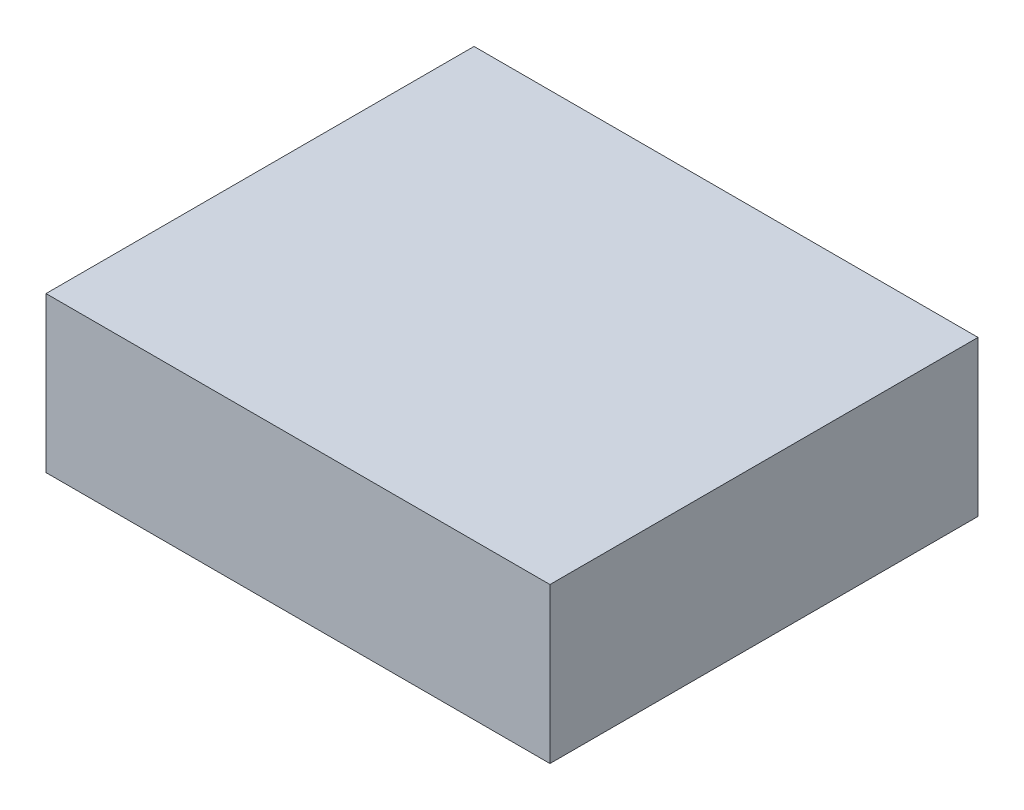
ISO-10303-21;
HEADER;
FILE_DESCRIPTION(('STEP AP214'),'2;1');
FILE_NAME('part.step','',(''),(''),'','','');
FILE_SCHEMA(('AUTOMOTIVE_DESIGN { 1 0 10303 214 1 1 1 1 }'));
ENDSEC;
DATA;
#1=APPLICATION_CONTEXT('core data for automotive mechanical design processes');
#2=APPLICATION_PROTOCOL_DEFINITION('international standard','automotive_design',2000,#1);
#3=PRODUCT_CONTEXT('',#1,'mechanical');
#4=PRODUCT('Part','Part','',(#3));
#5=PRODUCT_RELATED_PRODUCT_CATEGORY('part','',(#4));
#6=PRODUCT_DEFINITION_FORMATION('','',#4);
#7=PRODUCT_DEFINITION_CONTEXT('part definition',#1,'design');
#8=PRODUCT_DEFINITION('design','',#6,#7);
#9=PRODUCT_DEFINITION_SHAPE('','',#8);
#10=(LENGTH_UNIT() NAMED_UNIT(*) SI_UNIT(.MILLI.,.METRE.));
#11=(NAMED_UNIT(*) PLANE_ANGLE_UNIT() SI_UNIT($,.RADIAN.));
#12=(NAMED_UNIT(*) SI_UNIT($,.STERADIAN.) SOLID_ANGLE_UNIT());
#13=UNCERTAINTY_MEASURE_WITH_UNIT(LENGTH_MEASURE(1.E-05),#10,'distance_accuracy_value','');
#14=(GEOMETRIC_REPRESENTATION_CONTEXT(3) GLOBAL_UNCERTAINTY_ASSIGNED_CONTEXT((#13)) GLOBAL_UNIT_ASSIGNED_CONTEXT((#10,
#11,#12)) REPRESENTATION_CONTEXT('',''));
#15=CARTESIAN_POINT('',(0.,0.,0.));
#16=DIRECTION('',(0.,0.,1.));
#17=DIRECTION('',(1.,0.,0.));
#18=AXIS2_PLACEMENT_3D('',#15,#16,#17);
#19=CARTESIAN_POINT('',(578.512311239903,1767.66793795148,3816.62523051777));
#20=DIRECTION('',(0.,0.,1.));
#21=DIRECTION('',(1.,0.,0.));
#22=AXIS2_PLACEMENT_3D('',#19,#20,#21);
#23=PLANE('',#22);
#24=CARTESIAN_POINT('',(3.35859283212269E-12,1307.60232413112,3816.62523051777));
#25=CARTESIAN_POINT('',(311.663156664792,1307.60232413112,3816.62523051777));
#26=CARTESIAN_POINT('',(658.286988831179,1506.92559400655,3816.62523051777));
#27=CARTESIAN_POINT('',(508.732628252425,2008.29767103519,3816.62523051777));
#28=CARTESIAN_POINT('',(263.517511266539,2292.73608518715,3816.62523051777));
#29=CARTESIAN_POINT('',(1.81342770605281E-12,2292.73608518715,3816.62523051777));
#30=B_SPLINE_CURVE_WITH_KNOTS('',3,(#24,#25,#26,#27,#28,#29),.UNSPECIFIED.,.F.,.F.,(4,1,1,4),
(0.,0.440154996315031,0.540154996315031,1.),.UNSPECIFIED.);
#31=CARTESIAN_POINT('',(4.44089209850063E-12,1307.60232413112,3816.62523051777));
#32=VERTEX_POINT('',#31);
#33=CARTESIAN_POINT('',(1.8426819144304E-12,2292.73608518715,3816.62523051777));
#34=VERTEX_POINT('',#33);
#35=EDGE_CURVE('E103',#32,#34,#30,.T.);
#36=ORIENTED_EDGE('',*,*,#35,.F.);
#37=DIRECTION('',(0.,-1.,0.));
#38=VECTOR('',#37,1.);
#39=CARTESIAN_POINT('',(1.8426819144304E-12,2292.73608518715,3816.62523051777));
#40=LINE('',#39,#38);
#41=EDGE_CURVE('E14',#34,#32,#40,.T.);
#42=ORIENTED_EDGE('',*,*,#41,.F.);
#43=EDGE_LOOP('',(#36,#42));
#44=FACE_BOUND('',#43,.T.);
#45=ADVANCED_FACE('F93',(#44),#23,.F.);
#46=CARTESIAN_POINT('',(280.601112147711,1769.42529815313,4859.43859731402));
#47=DIRECTION('',(0.,0.,-1.));
#48=DIRECTION('',(-1.,0.,0.));
#49=AXIS2_PLACEMENT_3D('',#46,#47,#48);
#50=PLANE('',#49);
#51=CARTESIAN_POINT('',(3.21867792923516E-12,1471.01280702623,4859.43859731402));
#52=CARTESIAN_POINT('',(142.33250766166,1471.01280702623,4859.43859731402));
#53=CARTESIAN_POINT('',(409.517061432889,1784.66913630055,4859.43859731402));
#54=CARTESIAN_POINT('',(161.986589425112,2053.75570868667,4859.43859731402));
#55=CARTESIAN_POINT('',(1.96933968695581E-12,2053.75570868667,4859.43859731402));
#56=B_SPLINE_CURVE_WITH_KNOTS('',3,(#51,#52,#53,#54,#55),.UNSPECIFIED.,.F.,.F.,(4,1,4),(0.,
0.514058100600508,1.),.UNSPECIFIED.);
#57=CARTESIAN_POINT('',(3.21964677141295E-12,1471.01280702623,4859.43859731402));
#58=VERTEX_POINT('',#57);
#59=CARTESIAN_POINT('',(1.97833174901883E-12,2053.75570868666,4859.43859731402));
#60=VERTEX_POINT('',#59);
#61=EDGE_CURVE('E127',#58,#60,#56,.T.);
#62=ORIENTED_EDGE('',*,*,#61,.T.);
#63=DIRECTION('',(0.,-1.,0.));
#64=VECTOR('',#63,1.);
#65=CARTESIAN_POINT('',(1.97833174901883E-12,2053.75570868666,4859.43859731402));
#66=LINE('',#65,#64);
#67=EDGE_CURVE('E131',#60,#58,#66,.T.);
#68=ORIENTED_EDGE('',*,*,#67,.T.);
#69=EDGE_LOOP('',(#62,#68));
#70=FACE_BOUND('',#69,.T.);
#71=ADVANCED_FACE('F140',(#70),#50,.F.);
#72=CARTESIAN_POINT('',(1.96933968695581E-12,2053.75570868667,4859.43859731402));
#73=CARTESIAN_POINT('',(2.20347694768638E-12,2145.07581098438,4598.01378079925));
#74=CARTESIAN_POINT('',(2.10891987785537E-12,2225.66611453984,4235.969530354));
#75=CARTESIAN_POINT('',(1.81342770605281E-12,2292.73608518715,3816.62523051777));
#76=CARTESIAN_POINT('',(9.67679591758664,2053.75570868667,4859.43859731402));
#77=CARTESIAN_POINT('',(12.5615030029707,2145.07581098438,4598.01378079925));
#78=CARTESIAN_POINT('',(15.4462100883545,2225.66611453984,4235.969530354));
#79=CARTESIAN_POINT('',(18.3309171737381,2292.73608518715,3816.62523051777));
#80=CARTESIAN_POINT('',(29.1522170583883,2052.8209062107,4859.43859731401));
#81=CARTESIAN_POINT('',(37.8809193005053,2143.59768593684,4597.90652234443));
#82=CARTESIAN_POINT('',(46.4890734451176,2223.75793132974,4235.77444772832));
#83=CARTESIAN_POINT('',(54.7412788450328,2290.46730456613,3816.62523051776));
#84=CARTESIAN_POINT('',(58.4049727797032,2048.43446433916,4859.43859731404));
#85=CARTESIAN_POINT('',(75.9038826545794,2136.94193777903,4597.46408121834));
#86=CARTESIAN_POINT('',(92.8042925590807,2215.29727419024,4234.96973189746));
#87=CARTESIAN_POINT('',(107.899284666168,2280.49338085988,3816.62523051778));
#88=CARTESIAN_POINT('',(87.3287437799484,2040.95733310128,4859.438597314));
#89=CARTESIAN_POINT('',(113.429186845245,2125.98362934244,4596.78030856885));
#90=CARTESIAN_POINT('',(138.220562906585,2201.5713940146,4233.7260801588));
#91=CARTESIAN_POINT('',(158.993806480537,2264.45809168024,3816.62523051776));
#92=CARTESIAN_POINT('',(115.532790262652,2030.36451535917,4859.43859731403));
#93=CARTESIAN_POINT('',(149.960194339749,2110.96764933798,4595.89542631665));
#94=CARTESIAN_POINT('',(182.199863784492,2183.04977282652,4232.11664849706));
#95=CARTESIAN_POINT('',(207.597740713041,2243.0345813963,3816.62523051778));
#96=CARTESIAN_POINT('',(142.622152261656,2016.71291073118,4859.43859731401));
#97=CARTESIAN_POINT('',(185.059829914207,2092.21056038003,4594.84965638216));
#98=CARTESIAN_POINT('',(224.327519277096,2160.26334370044,4230.21459289677));
#99=CARTESIAN_POINT('',(253.471111054564,2216.94722257514,3816.62523051775));
#100=CARTESIAN_POINT('',(168.213880818237,2000.13299584241,4859.43859731403));
#101=CARTESIAN_POINT('',(218.350901482458,2070.06427982602,4593.68322068606));
#102=CARTESIAN_POINT('',(264.296608736699,2133.74017219016,4228.09306934265));
#103=CARTESIAN_POINT('',(296.52956859429,2186.87929799954,3816.62523051778));
#104=CARTESIAN_POINT('',(191.946742586554,1980.81668793771,4859.438597314));
#105=CARTESIAN_POINT('',(249.505409911143,2044.89191827624,4592.43634114879));
#106=CARTESIAN_POINT('',(301.876881808322,2103.96926971542,4225.82523381923));
#107=CARTESIAN_POINT('',(336.79291205404,2153.42478894127,3816.62523051776));
#108=CARTESIAN_POINT('',(213.48571992049,1959.00470877204,4859.43859731404));
#109=CARTESIAN_POINT('',(278.232247547486,2017.05371624495,4591.14923969102));
#110=CARTESIAN_POINT('',(336.88565539843,2071.38510301376,4223.48424231123));
#111=CARTESIAN_POINT('',(374.339183197937,2117.07145739379,3816.62523051777));
#112=CARTESIAN_POINT('',(232.522374963014,1934.97690998352,4859.43859731399));
#113=CARTESIAN_POINT('',(304.265322487118,1986.90161675311,4589.8621382332));
#114=CARTESIAN_POINT('',(369.163698121217,2036.36641395304,4221.1432508032));
#115=CARTESIAN_POINT('',(409.268311457155,2078.20391310444,3816.62523051778));
#116=CARTESIAN_POINT('',(246.06573804929,1913.36852673342,4859.43859731404));
#117=CARTESIAN_POINT('',(323.506889439456,1960.13329292257,4588.82307195219));
#118=CARTESIAN_POINT('',(393.659747845147,2005.42970915674,4219.25338786704));
#119=CARTESIAN_POINT('',(436.276322456801,2043.96360891617,3816.62523051776));
#120=CARTESIAN_POINT('',(255.380652857337,1895.30373083373,4859.43859731402));
#121=CARTESIAN_POINT('',(337.309528011798,1937.90343690475,4588.03204084791));
#122=CARTESIAN_POINT('',(411.736883989455,1979.77147464615,4217.81465350275));
#123=CARTESIAN_POINT('',(456.661517351416,2015.56835746227,3816.62523051777));
#124=CARTESIAN_POINT('',(261.579290959012,1881.41358695722,4859.43859731401));
#125=CARTESIAN_POINT('',(346.838062022896,1920.86616802997,4587.46390622005));
#126=CARTESIAN_POINT('',(424.514333928087,1960.10564739192,4216.7813252199));
#127=CARTESIAN_POINT('',(471.345880826164,1993.789644765,3816.62523051777));
#128=CARTESIAN_POINT('',(266.962720882451,1867.22939382701,4859.43859731402));
#129=CARTESIAN_POINT('',(355.514578241559,1903.50632306888,4586.92593803262));
#130=CARTESIAN_POINT('',(436.489960443184,1940.04911105156,4215.80286392554));
#131=CARTESIAN_POINT('',(485.430479508403,1971.54662538517,3816.62523051777));
#132=CARTESIAN_POINT('',(271.508974733462,1852.80301697592,4859.43859731403));
#133=CARTESIAN_POINT('',(363.313199526139,1885.86749653145,4586.42316402567));
#134=CARTESIAN_POINT('',(447.64204146638,1919.63152754522,4214.88841411772));
#135=CARTESIAN_POINT('',(498.91678394035,1948.85241228215,3816.62523051776));
#136=CARTESIAN_POINT('',(275.196084617851,1838.1863219368,4859.43859731402));
#137=CARTESIAN_POINT('',(370.207013333605,1867.99250529231,4585.96061193927));
#138=CARTESIAN_POINT('',(457.946784126539,1898.8810035223,4214.04712029453));
#139=CARTESIAN_POINT('',(511.803158460072,1925.7177855092,3816.62523051777));
#140=CARTESIAN_POINT('',(278.010255760603,1823.43509711282,4859.43859731401));
#141=CARTESIAN_POINT('',(376.173510091729,1849.92571718839,4585.54330951349));
#142=CARTESIAN_POINT('',(467.381028374963,1877.82482468649,4213.28812695403));
#143=CARTESIAN_POINT('',(524.084830079696,1902.15033226586,3816.62523051777));
#144=CARTESIAN_POINT('',(279.937693386704,1808.60513090719,4859.43859731403));
#145=CARTESIAN_POINT('',(381.188405675857,1831.71064177834,4585.17628448843));
#146=CARTESIAN_POINT('',(475.918065058095,1856.48856018488,4212.62057859432));
#147=CARTESIAN_POINT('',(535.751702154068,1878.15506491673,3816.62523051777));
#148=CARTESIAN_POINT('',(280.975227102163,1793.75472155939,4859.43859731401));
#149=CARTESIAN_POINT('',(385.23367866478,1813.39174424936,4584.86456460411));
#150=CARTESIAN_POINT('',(483.533086048242,1834.8971805854,4212.05361971347));
#151=CARTESIAN_POINT('',(546.791217386314,1853.73484303953,3816.62523051777));
#152=CARTESIAN_POINT('',(281.119464583627,1778.94172736932,4859.43859731403));
#153=CARTESIAN_POINT('',(388.287737665393,1795.01225279676,4584.61317760065));
#154=CARTESIAN_POINT('',(490.194365203287,1813.07362241177,4211.59639480957));
#155=CARTESIAN_POINT('',(557.180552422604,1828.88969511547,3816.62523051776));
#156=CARTESIAN_POINT('',(280.385393856844,1764.22464095252,4859.43859731401));
#157=CARTESIAN_POINT('',(390.342428004064,1776.61574380279,4584.42715121806));
#158=CARTESIAN_POINT('',(495.878669470956,1791.04088424596,4211.25804838067));
#159=CARTESIAN_POINT('',(566.900433369329,1803.61942555531,3816.62523051777));
#160=CARTESIAN_POINT('',(278.836023793971,1749.65451806857,4859.43859731403));
#161=CARTESIAN_POINT('',(391.340252759631,1758.21285967528,4584.31151319647));
#162=CARTESIAN_POINT('',(500.416060457506,1768.76353357701,4211.04772492487));
#163=CARTESIAN_POINT('',(575.687517897462,1777.83991055842,3816.62523051777));
#164=CARTESIAN_POINT('',(277.296653291996,1740.06711484498,4859.43859731402));
#165=CARTESIAN_POINT('',(391.24203008519,1745.9450125988,4584.28469858276));
#166=CARTESIAN_POINT('',(502.526955132117,1753.7270656023,4210.99895426846));
#167=CARTESIAN_POINT('',(580.696416193424,1760.26368187115,3816.62523051777));
#168=CARTESIAN_POINT('',(275.593899027511,1730.9349892098,4859.43859731402));
#169=CARTESIAN_POINT('',(390.743334107864,1734.1730845636,4584.28469858276));
#170=CARTESIAN_POINT('',(504.023198884524,1739.19989660927,4210.99895426846));
#171=CARTESIAN_POINT('',(584.958431196921,1743.190852295,3816.62523051777));
#172=CARTESIAN_POINT('',(273.765893612666,1722.25611677653,4859.43859731402));
#173=CARTESIAN_POINT('',(389.996783987917,1722.84863297036,4584.31652445416));
#174=CARTESIAN_POINT('',(505.073037242782,1725.15936869481,4211.06001252362));
#175=CARTESIAN_POINT('',(588.561080863629,1726.65216669828,3816.62523051778));
#176=CARTESIAN_POINT('',(271.022575125726,1711.59617952931,4859.43859731402));
#177=CARTESIAN_POINT('',(388.292867560773,1708.6032939296,4584.43089867944));
#178=CARTESIAN_POINT('',(505.199609805925,1707.33482874994,4211.27944062806));
#179=CARTESIAN_POINT('',(591.503412663345,1705.56035405776,3816.62523051776));
#180=CARTESIAN_POINT('',(268.572304995532,1703.18581274195,4859.43859731402));
#181=CARTESIAN_POINT('',(386.395009256364,1697.17979603983,4584.56416951588));
#182=CARTESIAN_POINT('',(504.428404088568,1692.95615383357,4211.53512207153));
#183=CARTESIAN_POINT('',(592.668176872922,1688.49786761333,3816.62523051777));
#184=CARTESIAN_POINT('',(266.610650352636,1696.93735312301,4859.43859731402));
#185=CARTESIAN_POINT('',(384.682363433085,1688.60980426217,4584.68426245244));
#186=CARTESIAN_POINT('',(503.36686300081,1682.13369212612,4211.76552158121));
#187=CARTESIAN_POINT('',(592.874593126465,1675.63689781233,3816.62523051777));
#188=CARTESIAN_POINT('',(264.528899289558,1690.74873294202,4859.43859731403));
#189=CARTESIAN_POINT('',(382.665295880733,1680.05072826591,4584.82374927937));
#190=CARTESIAN_POINT('',(501.788719956552,1671.29791920549,4212.03312846512));
#191=CARTESIAN_POINT('',(592.361405826393,1662.74835376241,3816.62523051775));
#192=CARTESIAN_POINT('',(261.598243478639,1682.57772390646,4859.43859731403));
#193=CARTESIAN_POINT('',(379.573298331794,1668.67344006938,4585.03459567731));
#194=CARTESIAN_POINT('',(498.998201756728,1656.8710925717,4212.43763940554));
#195=CARTESIAN_POINT('',(590.71839883681,1645.58321002521,3816.62523051779));
#196=CARTESIAN_POINT('',(257.653960789888,1672.51618103875,4859.43859731402));
#197=CARTESIAN_POINT('',(374.955736484353,1654.55463971244,4585.34290880635));
#198=CARTESIAN_POINT('',(494.219898495761,1638.94820223473,4213.02914125231));
#199=CARTESIAN_POINT('',(586.856410711706,1624.26779750497,3816.62523051775));
#200=CARTESIAN_POINT('',(252.493242832111,1660.68921777138,4859.43859731402));
#201=CARTESIAN_POINT('',(368.254296316606,1637.89069786446,4585.77852542096));
#202=CARTESIAN_POINT('',(486.493037522346,1617.83546930381,4213.86487611975));
#203=CARTESIAN_POINT('',(579.422335784206,1599.23243062613,3816.62523051778));
#204=CARTESIAN_POINT('',(246.926908091947,1649.11248136896,4859.43859731403));
#205=CARTESIAN_POINT('',(360.469017881978,1621.60207816153,4586.2738155444));
#206=CARTESIAN_POINT('',(476.910210799787,1597.30034020402,4214.81509521558));
#207=CARTESIAN_POINT('',(569.380418853141,1575.00543501526,3816.62523051776));
#208=CARTESIAN_POINT('',(240.973426880945,1637.78791837023,4859.43859731404));
#209=CARTESIAN_POINT('',(351.694447909919,1605.7612088547,4586.82281182583));
#210=CARTESIAN_POINT('',(465.647879367552,1577.4785248181,4215.868350117));
#211=CARTESIAN_POINT('',(556.983547503535,1551.78201215856,3816.62523051778));
#212=CARTESIAN_POINT('',(234.651269510656,1626.71747531389,4859.43859731404));
#213=CARTESIAN_POINT('',(342.033133346926,1590.41713574002,4587.41954691431));
#214=CARTESIAN_POINT('',(452.898504699205,1558.45896811879,4217.01319240113));
#215=CARTESIAN_POINT('',(542.508609971552,1529.68721617727,3816.62523051776));
#216=CARTESIAN_POINT('',(227.970336506834,1615.90563902928,4859.43859731403));
#217=CARTESIAN_POINT('',(331.580320138196,1575.60097266324,4588.05805345899));
#218=CARTESIAN_POINT('',(438.84851605151,1540.29221088763,4218.23817364515));
#219=CARTESIAN_POINT('',(526.227731061054,1508.78722476052,3816.62523051777));
#220=CARTESIAN_POINT('',(220.940528395234,1605.35689634574,4859.43859731402));
#221=CARTESIAN_POINT('',(320.424551050158,1561.32931160405,4588.73236410897));
#222=CARTESIAN_POINT('',(423.670936323683,1522.999750174,4219.53184542622));
#223=CARTESIAN_POINT('',(508.392926039586,1489.10464999922,3816.62523051776));
#224=CARTESIAN_POINT('',(213.571745701612,1595.07573409259,4859.43859731401));
#225=CARTESIAN_POINT('',(308.644376380971,1547.60899295627,4589.43651151339));
#226=CARTESIAN_POINT('',(407.518803478414,1506.58357985557,4220.88275932152));
#227=CARTESIAN_POINT('',(489.226232769895,1470.63284922669,3816.62523051778));
#228=CARTESIAN_POINT('',(205.873888951721,1585.06663909915,4859.43859731402));
#229=CARTESIAN_POINT('',(296.309772530233,1534.44092303111,4590.16452832134));
#230=CARTESIAN_POINT('',(390.528007681258,1491.03382564484,4222.27946690815));
#231=CARTESIAN_POINT('',(468.923967419034,1453.34737752848,3816.62523051775));
#232=CARTESIAN_POINT('',(195.175286375364,1572.0955348405,4859.43859731403));
#233=CARTESIAN_POINT('',(279.196302134095,1517.62046882328,4591.15908680217));
#234=CARTESIAN_POINT('',(366.903022000673,1471.43612347135,4224.18753738173));
#235=CARTESIAN_POINT('',(440.556212146394,1431.83632385799,3816.62523051777));
#236=CARTESIAN_POINT('',(180.994242383705,1556.60532036509,4859.43859731403));
#237=CARTESIAN_POINT('',(256.677475329184,1497.97427180676,4592.4321216576));
#238=CARTESIAN_POINT('',(335.807595899658,1449.02303579532,4226.62986758789));
#239=CARTESIAN_POINT('',(403.035991645059,1407.73162992119,3816.62523051777));
#240=CARTESIAN_POINT('',(162.708855482239,1539.26291523401,4859.43859731401));
#241=CARTESIAN_POINT('',(228.154127496938,1476.60902320022,4593.95976348412));
#242=CARTESIAN_POINT('',(296.61759905093,1425.32259636957,4229.56066383526));
#243=CARTESIAN_POINT('',(355.623005987537,1382.94868282994,3816.62523051775));
#244=CARTESIAN_POINT('',(143.15153105416,1523.2959311716,4859.43859731403));
#245=CARTESIAN_POINT('',(198.33682122362,1457.49600033604,4595.43966650359));
#246=CARTESIAN_POINT('',(256.016217677356,1404.71432911309,4232.39987269995));
#247=CARTESIAN_POINT('',(306.49880193841,1362.0298759845,3816.62523051778));
#248=CARTESIAN_POINT('',(122.318084327084,1508.87582572125,4859.43859731403));
#249=CARTESIAN_POINT('',(167.383298043834,1440.72049319315,4596.82409190887));
#250=CARTESIAN_POINT('',(214.369822757493,1387.13975579525,4235.05590679912));
#251=CARTESIAN_POINT('',(256.194477804463,1344.74264271913,3816.62523051776));
#252=CARTESIAN_POINT('',(100.202906174114,1496.23210094814,4859.43859731402));
#253=CARTESIAN_POINT('',(135.415986516591,1426.42029979519,4598.06530089292));
#254=CARTESIAN_POINT('',(171.975583673217,1372.58736975302,4237.43717875015));
#255=CARTESIAN_POINT('',(205.138041674709,1330.89585145858,3816.62523051778));
#256=CARTESIAN_POINT('',(76.8212395356517,1485.65984445074,4859.43859731403));
#257=CARTESIAN_POINT('',(102.548135333231,1414.78836516576,4599.11555464866));
#258=CARTESIAN_POINT('',(129.09145800377,1361.09037278997,4239.45210117022));
#259=CARTESIAN_POINT('',(153.688257900567,1320.33264056088,3816.62523051776));
#260=CARTESIAN_POINT('',(52.2297838362937,1477.52924082597,4859.43859731402));
#261=CARTESIAN_POINT('',(68.9038644020431,1406.07640257118,4599.927114369));
#262=CARTESIAN_POINT('',(85.9556892780946,1352.72440619677,4241.00908667665));
#263=CARTESIAN_POINT('',(102.153591515905,1312.92225911544,3816.62523051777));
#264=CARTESIAN_POINT('',(26.563364324731,1472.27715969484,4859.43859731402));
#265=CARTESIAN_POINT('',(34.6472811041925,1400.58698110589,4600.45224124687));
#266=CARTESIAN_POINT('',(42.8083701467926,1347.60013789614,4242.01654788669));
#267=CARTESIAN_POINT('',(50.8062183250335,1308.55315364773,3816.62523051777));
#268=CARTESIAN_POINT('',(8.90223427259596,1471.01280702623,4859.43859731402));
#269=CARTESIAN_POINT('',(11.5556965023707,1399.2982088819,4600.57954473241));
#270=CARTESIAN_POINT('',(14.2091587321451,1346.4336337043,4242.26078090731));
#271=CARTESIAN_POINT('',(16.8626209619179,1307.60232413112,3816.62523051777));
#272=CARTESIAN_POINT('',(3.21867792923516E-12,1471.01280702623,4859.43859731402));
#273=CARTESIAN_POINT('',(4.0256201631143E-12,1399.2982088819,4600.57954473242));
#274=CARTESIAN_POINT('',(4.45893543976344E-12,1346.4336337043,4242.26078090731));
#275=CARTESIAN_POINT('',(3.35859283212269E-12,1307.60232413112,3816.62523051777));
#276=B_SPLINE_SURFACE_WITH_KNOTS('',3,3,((#72,#73,#74,#75),(#76,#77,#78,#79),(#80,#81,#82,#83),
(#84,#85,#86,#87),(#88,#89,#90,#91),(#92,#93,#94,#95),(#96,#97,#98,#99),(#100,#101,#102,#103),
(#104,#105,#106,#107),(#108,#109,#110,#111),(#112,#113,#114,#115),(#116,#117,#118,#119),(#120,
#121,#122,#123),(#124,#125,#126,#127),(#128,#129,#130,#131),(#132,#133,#134,#135),(#136,#137,
#138,#139),(#140,#141,#142,#143),(#144,#145,#146,#147),(#148,#149,#150,#151),(#152,#153,#154,
#155),(#156,#157,#158,#159),(#160,#161,#162,#163),(#164,#165,#166,#167),(#168,#169,#170,#171),
(#172,#173,#174,#175),(#176,#177,#178,#179),(#180,#181,#182,#183),(#184,#185,#186,#187),(#188,
#189,#190,#191),(#192,#193,#194,#195),(#196,#197,#198,#199),(#200,#201,#202,#203),(#204,#205,
#206,#207),(#208,#209,#210,#211),(#212,#213,#214,#215),(#216,#217,#218,#219),(#220,#221,#222,
#223),(#224,#225,#226,#227),(#228,#229,#230,#231),(#232,#233,#234,#235),(#236,#237,#238,#239),
(#240,#241,#242,#243),(#244,#245,#246,#247),(#248,#249,#250,#251),(#252,#253,#254,#255),(#256,
#257,#258,#259),(#260,#261,#262,#263),(#264,#265,#266,#267),(#268,#269,#270,#271),(#272,#273,
#274,#275)),.UNSPECIFIED.,.F.,.F.,.F.,(4,1,1,1,1,1,1,1,1,1,1,1,1,1,1,1,1,1,1,1,1,1,2,1,1,1,1,1,
1,1,1,1,1,1,1,1,1,1,1,1,1,1,1,1,1,1,1,4),(4,4),(0.,0.0325527583052488,0.0651055166104977,
0.0976582749157465,0.130211033220995,0.162763791526244,0.195316549831493,0.227869308136742,
0.260422066441991,0.292974824747239,0.325527583052488,0.341803962205113,0.358080341357737,
0.374356720510362,0.390633099662986,0.40690947881561,0.423185857968235,0.439462237120859,
0.455738616273484,0.472014995426108,0.488291374578732,0.504567753731357,0.520844132883981,
0.535817753731357,0.550791374578732,0.55827818500242,0.565764995426108,0.573251805849796,
0.580738616273484,0.595712237120859,0.610685857968235,0.62565947881561,0.640633099662986,
0.655606720510362,0.670580341357737,0.685553962205113,0.700527583052488,0.715501203899864,
0.730474824747239,0.760422066441991,0.790369308136742,0.820316549831493,0.850263791526244,
0.880211033220995,0.910158274915746,0.940105516610498,0.970052758305249,1.),(0.,1.),.UNSPECIFIED.);
#277=CARTESIAN_POINT('',(3.21867792923516E-12,1471.01280702623,4859.43859731402));
#278=CARTESIAN_POINT('',(4.0256201631143E-12,1399.2982088819,4600.57954473242));
#279=CARTESIAN_POINT('',(4.45893543976344E-12,1346.4336337043,4242.26078090731));
#280=CARTESIAN_POINT('',(3.35859283212269E-12,1307.60232413112,3816.62523051777));
#281=B_SPLINE_CURVE_WITH_KNOTS('',3,(#277,#278,#279,#280),.UNSPECIFIED.,.F.,.F.,(4,4),(0.,1.),.UNSPECIFIED.);
#282=EDGE_CURVE('E111',#58,#32,#281,.T.);
#283=CARTESIAN_POINT('',(1.96933968695581E-12,2053.75570868667,4859.43859731402));
#284=CARTESIAN_POINT('',(2.20347694768638E-12,2145.07581098438,4598.01378079925));
#285=CARTESIAN_POINT('',(2.10891987785537E-12,2225.66611453984,4235.969530354));
#286=CARTESIAN_POINT('',(1.81342770605281E-12,2292.73608518715,3816.62523051777));
#287=B_SPLINE_CURVE_WITH_KNOTS('',3,(#283,#284,#285,#286),.UNSPECIFIED.,.F.,.F.,(4,4),(0.,1.),.UNSPECIFIED.);
#288=EDGE_CURVE('E123',#34,#60,#287,.F.);
#289=ORIENTED_EDGE('',*,*,#61,.F.);
#290=ORIENTED_EDGE('',*,*,#282,.T.);
#291=ORIENTED_EDGE('',*,*,#35,.T.);
#292=ORIENTED_EDGE('',*,*,#288,.T.);
#293=EDGE_LOOP('',(#289,#290,#291,#292));
#294=FACE_BOUND('',#293,.T.);
#295=ADVANCED_FACE('F125',(#294),#276,.T.);
#296=CARTESIAN_POINT('',(3.21964677141295E-12,1471.01280702623,4859.43859731402));
#297=DIRECTION('',(-1.,0.,0.));
#298=DIRECTION('',(0.,1.,0.));
#299=AXIS2_PLACEMENT_3D('',#296,#297,#298);
#300=PLANE('',#299);
#301=ORIENTED_EDGE('',*,*,#67,.F.);
#302=ORIENTED_EDGE('',*,*,#288,.F.);
#303=ORIENTED_EDGE('',*,*,#41,.T.);
#304=ORIENTED_EDGE('',*,*,#282,.F.);
#305=EDGE_LOOP('',(#301,#302,#303,#304));
#306=FACE_BOUND('',#305,.T.);
#307=ADVANCED_FACE('F134',(#306),#300,.T.);
#308=CLOSED_SHELL('',(#45,#71,#295,#307));
#309=MANIFOLD_SOLID_BREP('B2',#308);
#310=CARTESIAN_POINT('',(6240.,3840.,5300.));
#311=DIRECTION('',(-1.,0.,0.));
#312=DIRECTION('',(0.,0.,1.));
#313=AXIS2_PLACEMENT_3D('',#310,#311,#312);
#314=PLANE('',#313);
#315=DIRECTION('',(0.,0.,-1.));
#316=VECTOR('',#315,1.);
#317=CARTESIAN_POINT('',(6240.,0.,5300.));
#318=LINE('',#317,#316);
#319=CARTESIAN_POINT('',(6240.,0.,5300.));
#320=VERTEX_POINT('',#319);
#321=CARTESIAN_POINT('',(6240.,0.,-5300.));
#322=VERTEX_POINT('',#321);
#323=EDGE_CURVE('E346',#320,#322,#318,.T.);
#324=ORIENTED_EDGE('',*,*,#323,.T.);
#325=DIRECTION('',(0.,-1.,0.));
#326=VECTOR('',#325,1.);
#327=CARTESIAN_POINT('',(6240.,3840.,-5300.));
#328=LINE('',#327,#326);
#329=CARTESIAN_POINT('',(6240.,3840.,-5300.));
#330=VERTEX_POINT('',#329);
#331=EDGE_CURVE('E91',#330,#322,#328,.T.);
#332=ORIENTED_EDGE('',*,*,#331,.F.);
#333=DIRECTION('',(0.,0.,-1.));
#334=VECTOR('',#333,1.);
#335=CARTESIAN_POINT('',(6240.,3840.,5300.));
#336=LINE('',#335,#334);
#337=CARTESIAN_POINT('',(6240.,3840.,5300.));
#338=VERTEX_POINT('',#337);
#339=EDGE_CURVE('E334',#338,#330,#336,.T.);
#340=ORIENTED_EDGE('',*,*,#339,.F.);
#341=DIRECTION('',(0.,-1.,0.));
#342=VECTOR('',#341,1.);
#343=CARTESIAN_POINT('',(6240.,3840.,5300.));
#344=LINE('',#343,#342);
#345=EDGE_CURVE('E342',#338,#320,#344,.T.);
#346=ORIENTED_EDGE('',*,*,#345,.T.);
#347=EDGE_LOOP('',(#324,#332,#340,#346));
#348=FACE_BOUND('',#347,.T.);
#349=ADVANCED_FACE('F283',(#348),#314,.F.);
#350=CARTESIAN_POINT('',(-6240.,3840.,-5300.));
#351=DIRECTION('',(0.,0.,1.));
#352=DIRECTION('',(1.,0.,0.));
#353=AXIS2_PLACEMENT_3D('',#350,#351,#352);
#354=PLANE('',#353);
#355=DIRECTION('',(-1.,0.,0.));
#356=VECTOR('',#355,1.);
#357=CARTESIAN_POINT('',(-6240.,0.,-5300.));
#358=LINE('',#357,#356);
#359=CARTESIAN_POINT('',(-6240.,0.,-5300.));
#360=VERTEX_POINT('',#359);
#361=EDGE_CURVE('E338',#322,#360,#358,.T.);
#362=ORIENTED_EDGE('',*,*,#361,.T.);
#363=DIRECTION('',(0.,-1.,0.));
#364=VECTOR('',#363,1.);
#365=CARTESIAN_POINT('',(-6240.,3840.,-5300.));
#366=LINE('',#365,#364);
#367=CARTESIAN_POINT('',(-6240.,3840.,-5300.));
#368=VERTEX_POINT('',#367);
#369=EDGE_CURVE('E291',#368,#360,#366,.T.);
#370=ORIENTED_EDGE('',*,*,#369,.F.);
#371=DIRECTION('',(-1.,0.,0.));
#372=VECTOR('',#371,1.);
#373=CARTESIAN_POINT('',(-6240.,3840.,-5300.));
#374=LINE('',#373,#372);
#375=EDGE_CURVE('E329',#330,#368,#374,.T.);
#376=ORIENTED_EDGE('',*,*,#375,.F.);
#377=ORIENTED_EDGE('',*,*,#331,.T.);
#378=EDGE_LOOP('',(#362,#370,#376,#377));
#379=FACE_BOUND('',#378,.T.);
#380=ADVANCED_FACE('F337',(#379),#354,.F.);
#381=CARTESIAN_POINT('',(-6240.,3840.,5300.));
#382=DIRECTION('',(1.,0.,0.));
#383=DIRECTION('',(0.,0.,-1.));
#384=AXIS2_PLACEMENT_3D('',#381,#382,#383);
#385=PLANE('',#384);
#386=DIRECTION('',(0.,0.,1.));
#387=VECTOR('',#386,1.);
#388=CARTESIAN_POINT('',(-6240.,0.,5300.));
#389=LINE('',#388,#387);
#390=CARTESIAN_POINT('',(-6240.,0.,5300.));
#391=VERTEX_POINT('',#390);
#392=EDGE_CURVE('E316',#360,#391,#389,.T.);
#393=ORIENTED_EDGE('',*,*,#392,.T.);
#394=DIRECTION('',(0.,-1.,0.));
#395=VECTOR('',#394,1.);
#396=CARTESIAN_POINT('',(-6240.,3840.,5300.));
#397=LINE('',#396,#395);
#398=CARTESIAN_POINT('',(-6240.,3840.,5300.));
#399=VERTEX_POINT('',#398);
#400=EDGE_CURVE('E339',#399,#391,#397,.T.);
#401=ORIENTED_EDGE('',*,*,#400,.F.);
#402=DIRECTION('',(0.,0.,1.));
#403=VECTOR('',#402,1.);
#404=CARTESIAN_POINT('',(-6240.,3840.,5300.));
#405=LINE('',#404,#403);
#406=EDGE_CURVE('E332',#368,#399,#405,.T.);
#407=ORIENTED_EDGE('',*,*,#406,.F.);
#408=ORIENTED_EDGE('',*,*,#369,.T.);
#409=EDGE_LOOP('',(#393,#401,#407,#408));
#410=FACE_BOUND('',#409,.T.);
#411=ADVANCED_FACE('F340',(#410),#385,.F.);
#412=CARTESIAN_POINT('',(-6240.,3840.,5300.));
#413=DIRECTION('',(0.,0.,-1.));
#414=DIRECTION('',(-1.,0.,0.));
#415=AXIS2_PLACEMENT_3D('',#412,#413,#414);
#416=PLANE('',#415);
#417=DIRECTION('',(1.,0.,0.));
#418=VECTOR('',#417,1.);
#419=CARTESIAN_POINT('',(-6240.,0.,5300.));
#420=LINE('',#419,#418);
#421=EDGE_CURVE('E322',#391,#320,#420,.T.);
#422=ORIENTED_EDGE('',*,*,#421,.T.);
#423=ORIENTED_EDGE('',*,*,#345,.F.);
#424=DIRECTION('',(1.,0.,0.));
#425=VECTOR('',#424,1.);
#426=CARTESIAN_POINT('',(-6240.,3840.,5300.));
#427=LINE('',#426,#425);
#428=EDGE_CURVE('E299',#399,#338,#427,.T.);
#429=ORIENTED_EDGE('',*,*,#428,.F.);
#430=ORIENTED_EDGE('',*,*,#400,.T.);
#431=EDGE_LOOP('',(#422,#423,#429,#430));
#432=FACE_BOUND('',#431,.T.);
#433=ADVANCED_FACE('F353',(#432),#416,.F.);
#434=CARTESIAN_POINT('',(0.,3840.,0.));
#435=DIRECTION('',(0.,-1.,0.));
#436=DIRECTION('',(0.,0.,-1.));
#437=AXIS2_PLACEMENT_3D('',#434,#435,#436);
#438=PLANE('',#437);
#439=ORIENTED_EDGE('',*,*,#339,.T.);
#440=ORIENTED_EDGE('',*,*,#375,.T.);
#441=ORIENTED_EDGE('',*,*,#406,.T.);
#442=ORIENTED_EDGE('',*,*,#428,.T.);
#443=EDGE_LOOP('',(#439,#440,#441,#442));
#444=FACE_BOUND('',#443,.T.);
#445=ADVANCED_FACE('F330',(#444),#438,.F.);
#446=CARTESIAN_POINT('',(0.,0.,0.));
#447=DIRECTION('',(0.,-1.,0.));
#448=DIRECTION('',(0.,0.,-1.));
#449=AXIS2_PLACEMENT_3D('',#446,#447,#448);
#450=PLANE('',#449);
#451=ORIENTED_EDGE('',*,*,#323,.F.);
#452=ORIENTED_EDGE('',*,*,#421,.F.);
#453=ORIENTED_EDGE('',*,*,#392,.F.);
#454=ORIENTED_EDGE('',*,*,#361,.F.);
#455=EDGE_LOOP('',(#451,#452,#453,#454));
#456=FACE_BOUND('',#455,.T.);
#457=ADVANCED_FACE('F356',(#456),#450,.T.);
#458=CLOSED_SHELL('',(#349,#380,#411,#433,#445,#457));
#459=MANIFOLD_SOLID_BREP('B8_NOT_SHOWN',#458);
#460=ADVANCED_BREP_SHAPE_REPRESENTATION('',(#18,#309,#459),#14);
#461=SHAPE_DEFINITION_REPRESENTATION(#9,#460);
ENDSEC;
END-ISO-10303-21;
